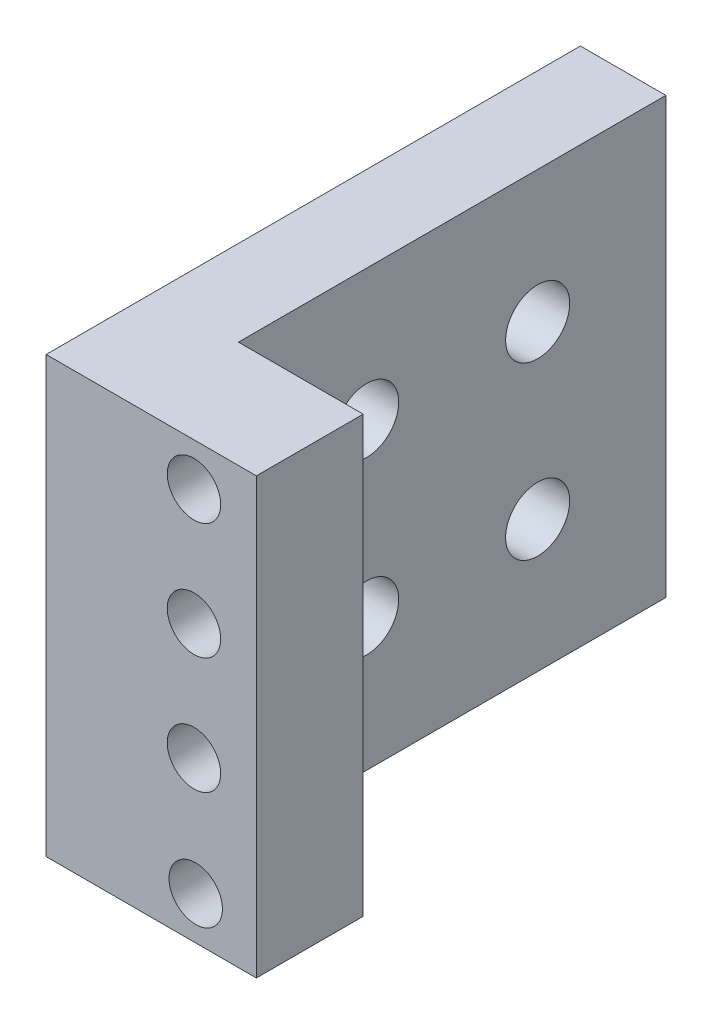
ISO-10303-21;
HEADER;
FILE_DESCRIPTION(('STEP AP214'),'2;1');
FILE_NAME('part.step','',(''),(''),'','','');
FILE_SCHEMA(('AUTOMOTIVE_DESIGN { 1 0 10303 214 1 1 1 1 }'));
ENDSEC;
DATA;
#1=APPLICATION_CONTEXT('core data for automotive mechanical design processes');
#2=APPLICATION_PROTOCOL_DEFINITION('international standard','automotive_design',2000,#1);
#3=PRODUCT_CONTEXT('',#1,'mechanical');
#4=PRODUCT('Part','Part','',(#3));
#5=PRODUCT_RELATED_PRODUCT_CATEGORY('part','',(#4));
#6=PRODUCT_DEFINITION_FORMATION('','',#4);
#7=PRODUCT_DEFINITION_CONTEXT('part definition',#1,'design');
#8=PRODUCT_DEFINITION('design','',#6,#7);
#9=PRODUCT_DEFINITION_SHAPE('','',#8);
#10=(LENGTH_UNIT() NAMED_UNIT(*) SI_UNIT(.MILLI.,.METRE.));
#11=(NAMED_UNIT(*) PLANE_ANGLE_UNIT() SI_UNIT($,.RADIAN.));
#12=(NAMED_UNIT(*) SI_UNIT($,.STERADIAN.) SOLID_ANGLE_UNIT());
#13=UNCERTAINTY_MEASURE_WITH_UNIT(LENGTH_MEASURE(1.E-05),#10,'distance_accuracy_value','');
#14=(GEOMETRIC_REPRESENTATION_CONTEXT(3) GLOBAL_UNCERTAINTY_ASSIGNED_CONTEXT((#13)) GLOBAL_UNIT_ASSIGNED_CONTEXT((#10,
#11,#12)) REPRESENTATION_CONTEXT('',''));
#15=CARTESIAN_POINT('',(0.,0.,0.));
#16=DIRECTION('',(0.,0.,1.));
#17=DIRECTION('',(1.,0.,0.));
#18=AXIS2_PLACEMENT_3D('',#15,#16,#17);
#19=CARTESIAN_POINT('',(0.,0.,5.));
#20=DIRECTION('',(0.,0.,-1.));
#21=DIRECTION('',(-1.,0.,0.));
#22=AXIS2_PLACEMENT_3D('',#19,#20,#21);
#23=PLANE('',#22);
#24=DIRECTION('',(0.,1.,0.));
#25=VECTOR('',#24,1.);
#26=CARTESIAN_POINT('',(2.83769731465408,-12.6118854219113,5.));
#27=LINE('',#26,#25);
#28=CARTESIAN_POINT('',(2.83769731465408,-12.6118854219113,5.));
#29=VERTEX_POINT('',#28);
#30=CARTESIAN_POINT('',(2.83769731465409,7.73752291264459,5.));
#31=VERTEX_POINT('',#30);
#32=EDGE_CURVE('E82',#29,#31,#27,.T.);
#33=ORIENTED_EDGE('',*,*,#32,.T.);
#34=DIRECTION('',(-1.,0.,0.));
#35=VECTOR('',#34,1.);
#36=CARTESIAN_POINT('',(-3.,7.73752291264459,5.));
#37=LINE('',#36,#35);
#38=CARTESIAN_POINT('',(-7.,7.73752291264459,5.));
#39=VERTEX_POINT('',#38);
#40=EDGE_CURVE('E92',#31,#39,#37,.T.);
#41=ORIENTED_EDGE('',*,*,#40,.T.);
#42=DIRECTION('',(0.,1.,0.));
#43=VECTOR('',#42,1.);
#44=CARTESIAN_POINT('',(-7.,7.73752291264459,5.));
#45=LINE('',#44,#43);
#46=CARTESIAN_POINT('',(-7.,-12.6118854219113,5.));
#47=VERTEX_POINT('',#46);
#48=EDGE_CURVE('E125',#47,#39,#45,.T.);
#49=ORIENTED_EDGE('',*,*,#48,.F.);
#50=DIRECTION('',(1.,0.,0.));
#51=VECTOR('',#50,1.);
#52=CARTESIAN_POINT('',(-3.,-12.6118854219113,5.));
#53=LINE('',#52,#51);
#54=EDGE_CURVE('E60',#47,#29,#53,.T.);
#55=ORIENTED_EDGE('',*,*,#54,.T.);
#56=EDGE_LOOP('',(#33,#41,#49,#55));
#57=FACE_BOUND('',#56,.T.);
#58=CARTESIAN_POINT('',(-0.0811513426729575,5.73752291264459,5.));
#59=DIRECTION('',(0.,0.,1.));
#60=DIRECTION('',(1.,0.,0.));
#61=AXIS2_PLACEMENT_3D('',#58,#59,#60);
#62=CIRCLE('',#61,1.25);
#63=CARTESIAN_POINT('',(1.16884865732704,5.73752291264459,5.));
#64=VERTEX_POINT('',#63);
#65=EDGE_CURVE('E90',#64,#64,#62,.T.);
#66=ORIENTED_EDGE('',*,*,#65,.F.);
#67=EDGE_LOOP('',(#66));
#68=FACE_BOUND('',#67,.T.);
#69=CARTESIAN_POINT('',(-0.0811513426729575,0.287522912644593,5.));
#70=DIRECTION('',(0.,0.,1.));
#71=DIRECTION('',(1.,0.,0.));
#72=AXIS2_PLACEMENT_3D('',#69,#70,#71);
#73=CIRCLE('',#72,1.25);
#74=CARTESIAN_POINT('',(1.16884865732704,0.287522912644593,5.));
#75=VERTEX_POINT('',#74);
#76=EDGE_CURVE('E102',#75,#75,#73,.T.);
#77=ORIENTED_EDGE('',*,*,#76,.F.);
#78=EDGE_LOOP('',(#77));
#79=FACE_BOUND('',#78,.T.);
#80=CARTESIAN_POINT('',(-0.0811513426729575,-5.16247708735541,5.));
#81=DIRECTION('',(0.,0.,1.));
#82=DIRECTION('',(1.,0.,0.));
#83=AXIS2_PLACEMENT_3D('',#80,#81,#82);
#84=CIRCLE('',#83,1.25);
#85=CARTESIAN_POINT('',(1.16884865732704,-5.16247708735541,5.));
#86=VERTEX_POINT('',#85);
#87=EDGE_CURVE('E108',#86,#86,#84,.T.);
#88=ORIENTED_EDGE('',*,*,#87,.F.);
#89=EDGE_LOOP('',(#88));
#90=FACE_BOUND('',#89,.T.);
#91=CARTESIAN_POINT('',(-0.000846901493414893,-10.6118854219113,5.));
#92=DIRECTION('',(0.,0.,1.));
#93=DIRECTION('',(1.,0.,0.));
#94=AXIS2_PLACEMENT_3D('',#91,#92,#93);
#95=CIRCLE('',#94,1.25);
#96=CARTESIAN_POINT('',(1.24915309850659,-10.6118854219113,5.));
#97=VERTEX_POINT('',#96);
#98=EDGE_CURVE('E114',#97,#97,#95,.T.);
#99=ORIENTED_EDGE('',*,*,#98,.F.);
#100=EDGE_LOOP('',(#99));
#101=FACE_BOUND('',#100,.T.);
#102=ADVANCED_FACE('F36',(#57,#68,#79,#90,#101),#23,.F.);
#103=CARTESIAN_POINT('',(0.,0.,0.));
#104=DIRECTION('',(0.,0.,-1.));
#105=DIRECTION('',(-1.,0.,0.));
#106=AXIS2_PLACEMENT_3D('',#103,#104,#105);
#107=PLANE('',#106);
#108=DIRECTION('',(0.,-1.,0.));
#109=VECTOR('',#108,1.);
#110=CARTESIAN_POINT('',(-3.,7.73752291264459,0.));
#111=LINE('',#110,#109);
#112=CARTESIAN_POINT('',(-3.,7.73752291264459,0.));
#113=VERTEX_POINT('',#112);
#114=CARTESIAN_POINT('',(-3.,-12.6118854219113,0.));
#115=VERTEX_POINT('',#114);
#116=EDGE_CURVE('E51',#113,#115,#111,.T.);
#117=ORIENTED_EDGE('',*,*,#116,.F.);
#118=DIRECTION('',(-1.,0.,0.));
#119=VECTOR('',#118,1.);
#120=CARTESIAN_POINT('',(-3.,7.73752291264459,0.));
#121=LINE('',#120,#119);
#122=CARTESIAN_POINT('',(2.83769731465409,7.73752291264459,0.));
#123=VERTEX_POINT('',#122);
#124=EDGE_CURVE('E83',#123,#113,#121,.T.);
#125=ORIENTED_EDGE('',*,*,#124,.F.);
#126=DIRECTION('',(0.,1.,0.));
#127=VECTOR('',#126,1.);
#128=CARTESIAN_POINT('',(2.83769731465409,7.73752291264459,0.));
#129=LINE('',#128,#127);
#130=CARTESIAN_POINT('',(2.83769731465408,-12.6118854219113,0.));
#131=VERTEX_POINT('',#130);
#132=EDGE_CURVE('E85',#131,#123,#129,.T.);
#133=ORIENTED_EDGE('',*,*,#132,.F.);
#134=DIRECTION('',(1.,0.,0.));
#135=VECTOR('',#134,1.);
#136=CARTESIAN_POINT('',(-3.,-12.6118854219113,0.));
#137=LINE('',#136,#135);
#138=EDGE_CURVE('E72',#115,#131,#137,.T.);
#139=ORIENTED_EDGE('',*,*,#138,.F.);
#140=EDGE_LOOP('',(#117,#125,#133,#139));
#141=FACE_BOUND('',#140,.T.);
#142=CARTESIAN_POINT('',(-0.0811513426729575,-5.16247708735541,0.));
#143=DIRECTION('',(0.,0.,1.));
#144=DIRECTION('',(1.,0.,0.));
#145=AXIS2_PLACEMENT_3D('',#142,#143,#144);
#146=CIRCLE('',#145,1.25);
#147=CARTESIAN_POINT('',(1.16884865732704,-5.16247708735541,0.));
#148=VERTEX_POINT('',#147);
#149=EDGE_CURVE('E111',#148,#148,#146,.T.);
#150=ORIENTED_EDGE('',*,*,#149,.T.);
#151=EDGE_LOOP('',(#150));
#152=FACE_BOUND('',#151,.T.);
#153=CARTESIAN_POINT('',(-0.0811513426729575,5.73752291264459,0.));
#154=DIRECTION('',(0.,0.,1.));
#155=DIRECTION('',(1.,0.,0.));
#156=AXIS2_PLACEMENT_3D('',#153,#154,#155);
#157=CIRCLE('',#156,1.25);
#158=CARTESIAN_POINT('',(1.16884865732704,5.73752291264459,0.));
#159=VERTEX_POINT('',#158);
#160=EDGE_CURVE('E99',#159,#159,#157,.T.);
#161=ORIENTED_EDGE('',*,*,#160,.T.);
#162=EDGE_LOOP('',(#161));
#163=FACE_BOUND('',#162,.T.);
#164=CARTESIAN_POINT('',(-0.0811513426729575,0.287522912644593,0.));
#165=DIRECTION('',(0.,0.,1.));
#166=DIRECTION('',(1.,0.,0.));
#167=AXIS2_PLACEMENT_3D('',#164,#165,#166);
#168=CIRCLE('',#167,1.25);
#169=CARTESIAN_POINT('',(1.16884865732704,0.287522912644593,0.));
#170=VERTEX_POINT('',#169);
#171=EDGE_CURVE('E105',#170,#170,#168,.T.);
#172=ORIENTED_EDGE('',*,*,#171,.T.);
#173=EDGE_LOOP('',(#172));
#174=FACE_BOUND('',#173,.T.);
#175=CARTESIAN_POINT('',(-0.000846901493414893,-10.6118854219113,0.));
#176=DIRECTION('',(0.,0.,1.));
#177=DIRECTION('',(1.,0.,0.));
#178=AXIS2_PLACEMENT_3D('',#175,#176,#177);
#179=CIRCLE('',#178,1.25);
#180=CARTESIAN_POINT('',(1.24915309850659,-10.6118854219113,0.));
#181=VERTEX_POINT('',#180);
#182=EDGE_CURVE('E117',#181,#181,#179,.T.);
#183=ORIENTED_EDGE('',*,*,#182,.T.);
#184=EDGE_LOOP('',(#183));
#185=FACE_BOUND('',#184,.T.);
#186=ADVANCED_FACE('F86',(#141,#152,#163,#174,#185),#107,.T.);
#187=CARTESIAN_POINT('',(2.83769731465409,7.73752291264459,5.));
#188=DIRECTION('',(-1.,0.,0.));
#189=DIRECTION('',(0.,-1.,0.));
#190=AXIS2_PLACEMENT_3D('',#187,#188,#189);
#191=PLANE('',#190);
#192=ORIENTED_EDGE('',*,*,#132,.T.);
#193=DIRECTION('',(0.,0.,-1.));
#194=VECTOR('',#193,1.);
#195=CARTESIAN_POINT('',(2.83769731465409,7.73752291264459,5.));
#196=LINE('',#195,#194);
#197=EDGE_CURVE('E11',#31,#123,#196,.T.);
#198=ORIENTED_EDGE('',*,*,#197,.F.);
#199=ORIENTED_EDGE('',*,*,#32,.F.);
#200=DIRECTION('',(0.,0.,-1.));
#201=VECTOR('',#200,1.);
#202=CARTESIAN_POINT('',(2.83769731465408,-12.6118854219113,5.));
#203=LINE('',#202,#201);
#204=EDGE_CURVE('E44',#29,#131,#203,.T.);
#205=ORIENTED_EDGE('',*,*,#204,.T.);
#206=EDGE_LOOP('',(#192,#198,#199,#205));
#207=FACE_BOUND('',#206,.T.);
#208=ADVANCED_FACE('F38',(#207),#191,.F.);
#209=CARTESIAN_POINT('',(-3.,7.73752291264459,5.));
#210=DIRECTION('',(0.,-1.,0.));
#211=DIRECTION('',(0.,0.,-1.));
#212=AXIS2_PLACEMENT_3D('',#209,#210,#211);
#213=PLANE('',#212);
#214=ORIENTED_EDGE('',*,*,#124,.T.);
#215=DIRECTION('',(0.,0.,1.));
#216=VECTOR('',#215,1.);
#217=CARTESIAN_POINT('',(-3.,7.73752291264459,-20.));
#218=LINE('',#217,#216);
#219=CARTESIAN_POINT('',(-3.,7.73752291264459,-20.));
#220=VERTEX_POINT('',#219);
#221=EDGE_CURVE('E131',#220,#113,#218,.T.);
#222=ORIENTED_EDGE('',*,*,#221,.F.);
#223=DIRECTION('',(-1.,0.,0.));
#224=VECTOR('',#223,1.);
#225=CARTESIAN_POINT('',(-3.,7.73752291264459,-20.));
#226=LINE('',#225,#224);
#227=CARTESIAN_POINT('',(-7.,7.73752291264459,-20.));
#228=VERTEX_POINT('',#227);
#229=EDGE_CURVE('E141',#220,#228,#226,.T.);
#230=ORIENTED_EDGE('',*,*,#229,.T.);
#231=DIRECTION('',(0.,0.,-1.));
#232=VECTOR('',#231,1.);
#233=CARTESIAN_POINT('',(-7.,7.73752291264459,0.));
#234=LINE('',#233,#232);
#235=EDGE_CURVE('E120',#39,#228,#234,.T.);
#236=ORIENTED_EDGE('',*,*,#235,.F.);
#237=ORIENTED_EDGE('',*,*,#40,.F.);
#238=ORIENTED_EDGE('',*,*,#197,.T.);
#239=EDGE_LOOP('',(#214,#222,#230,#236,#237,#238));
#240=FACE_BOUND('',#239,.T.);
#241=ADVANCED_FACE('F201',(#240),#213,.F.);
#242=CARTESIAN_POINT('',(-3.,-12.6118854219113,5.));
#243=DIRECTION('',(0.,1.,0.));
#244=DIRECTION('',(0.,0.,1.));
#245=AXIS2_PLACEMENT_3D('',#242,#243,#244);
#246=PLANE('',#245);
#247=DIRECTION('',(0.,0.,1.));
#248=VECTOR('',#247,1.);
#249=CARTESIAN_POINT('',(-7.,-12.6118854219113,0.));
#250=LINE('',#249,#248);
#251=CARTESIAN_POINT('',(-7.,-12.6118854219113,-20.));
#252=VERTEX_POINT('',#251);
#253=EDGE_CURVE('E128',#252,#47,#250,.T.);
#254=ORIENTED_EDGE('',*,*,#253,.F.);
#255=DIRECTION('',(-1.,0.,0.));
#256=VECTOR('',#255,1.);
#257=CARTESIAN_POINT('',(-3.,-12.6118854219113,-20.));
#258=LINE('',#257,#256);
#259=CARTESIAN_POINT('',(-3.,-12.6118854219113,-20.));
#260=VERTEX_POINT('',#259);
#261=EDGE_CURVE('E137',#260,#252,#258,.T.);
#262=ORIENTED_EDGE('',*,*,#261,.F.);
#263=DIRECTION('',(0.,0.,1.));
#264=VECTOR('',#263,1.);
#265=CARTESIAN_POINT('',(-3.,-12.6118854219113,-20.));
#266=LINE('',#265,#264);
#267=EDGE_CURVE('E81',#260,#115,#266,.T.);
#268=ORIENTED_EDGE('',*,*,#267,.T.);
#269=ORIENTED_EDGE('',*,*,#138,.T.);
#270=ORIENTED_EDGE('',*,*,#204,.F.);
#271=ORIENTED_EDGE('',*,*,#54,.F.);
#272=EDGE_LOOP('',(#254,#262,#268,#269,#270,#271));
#273=FACE_BOUND('',#272,.T.);
#274=ADVANCED_FACE('F75',(#273),#246,.F.);
#275=CARTESIAN_POINT('',(-0.0811513426729575,5.73752291264459,5.));
#276=DIRECTION('',(0.,0.,-1.));
#277=DIRECTION('',(-1.,0.,0.));
#278=AXIS2_PLACEMENT_3D('',#275,#276,#277);
#279=CYLINDRICAL_SURFACE('',#278,1.25);
#280=ORIENTED_EDGE('',*,*,#65,.T.);
#281=EDGE_LOOP('',(#280));
#282=FACE_BOUND('',#281,.T.);
#283=ORIENTED_EDGE('',*,*,#160,.F.);
#284=EDGE_LOOP('',(#283));
#285=FACE_BOUND('',#284,.T.);
#286=ADVANCED_FACE('F221',(#282,#285),#279,.F.);
#287=CARTESIAN_POINT('',(-0.0811513426729575,0.287522912644593,5.));
#288=DIRECTION('',(0.,0.,-1.));
#289=DIRECTION('',(-1.,0.,0.));
#290=AXIS2_PLACEMENT_3D('',#287,#288,#289);
#291=CYLINDRICAL_SURFACE('',#290,1.25);
#292=ORIENTED_EDGE('',*,*,#76,.T.);
#293=EDGE_LOOP('',(#292));
#294=FACE_BOUND('',#293,.T.);
#295=ORIENTED_EDGE('',*,*,#171,.F.);
#296=EDGE_LOOP('',(#295));
#297=FACE_BOUND('',#296,.T.);
#298=ADVANCED_FACE('F337',(#294,#297),#291,.F.);
#299=CARTESIAN_POINT('',(-0.0811513426729575,-5.16247708735541,5.));
#300=DIRECTION('',(0.,0.,-1.));
#301=DIRECTION('',(-1.,0.,0.));
#302=AXIS2_PLACEMENT_3D('',#299,#300,#301);
#303=CYLINDRICAL_SURFACE('',#302,1.25);
#304=ORIENTED_EDGE('',*,*,#87,.T.);
#305=EDGE_LOOP('',(#304));
#306=FACE_BOUND('',#305,.T.);
#307=ORIENTED_EDGE('',*,*,#149,.F.);
#308=EDGE_LOOP('',(#307));
#309=FACE_BOUND('',#308,.T.);
#310=ADVANCED_FACE('F329',(#306,#309),#303,.F.);
#311=CARTESIAN_POINT('',(-0.000846901493414893,-10.6118854219113,5.));
#312=DIRECTION('',(0.,0.,-1.));
#313=DIRECTION('',(-1.,0.,0.));
#314=AXIS2_PLACEMENT_3D('',#311,#312,#313);
#315=CYLINDRICAL_SURFACE('',#314,1.25);
#316=ORIENTED_EDGE('',*,*,#98,.T.);
#317=EDGE_LOOP('',(#316));
#318=FACE_BOUND('',#317,.T.);
#319=ORIENTED_EDGE('',*,*,#182,.F.);
#320=EDGE_LOOP('',(#319));
#321=FACE_BOUND('',#320,.T.);
#322=ADVANCED_FACE('F269',(#318,#321),#315,.F.);
#323=CARTESIAN_POINT('',(-7.,0.,0.));
#324=DIRECTION('',(-1.,0.,0.));
#325=DIRECTION('',(0.,0.,1.));
#326=AXIS2_PLACEMENT_3D('',#323,#324,#325);
#327=PLANE('',#326);
#328=CARTESIAN_POINT('',(-7.,-6.43718125463334,-6.));
#329=DIRECTION('',(-1.,0.,0.));
#330=DIRECTION('',(0.,0.,1.));
#331=AXIS2_PLACEMENT_3D('',#328,#329,#330);
#332=CIRCLE('',#331,1.5);
#333=CARTESIAN_POINT('',(-7.,-6.43718125463334,-4.5));
#334=VERTEX_POINT('',#333);
#335=EDGE_CURVE('E138',#334,#334,#332,.T.);
#336=ORIENTED_EDGE('',*,*,#335,.F.);
#337=EDGE_LOOP('',(#336));
#338=FACE_BOUND('',#337,.T.);
#339=CARTESIAN_POINT('',(-7.,-6.43718125463334,-14.));
#340=DIRECTION('',(-1.,0.,0.));
#341=DIRECTION('',(0.,0.,1.));
#342=AXIS2_PLACEMENT_3D('',#339,#340,#341);
#343=CIRCLE('',#342,1.5);
#344=CARTESIAN_POINT('',(-7.,-6.43718125463334,-12.5));
#345=VERTEX_POINT('',#344);
#346=EDGE_CURVE('E151',#345,#345,#343,.T.);
#347=ORIENTED_EDGE('',*,*,#346,.F.);
#348=EDGE_LOOP('',(#347));
#349=FACE_BOUND('',#348,.T.);
#350=CARTESIAN_POINT('',(-7.,1.56281874536667,-14.));
#351=DIRECTION('',(-1.,0.,0.));
#352=DIRECTION('',(0.,0.,1.));
#353=AXIS2_PLACEMENT_3D('',#350,#351,#352);
#354=CIRCLE('',#353,1.5);
#355=CARTESIAN_POINT('',(-7.,1.56281874536667,-12.5));
#356=VERTEX_POINT('',#355);
#357=EDGE_CURVE('E154',#356,#356,#354,.T.);
#358=ORIENTED_EDGE('',*,*,#357,.F.);
#359=EDGE_LOOP('',(#358));
#360=FACE_BOUND('',#359,.T.);
#361=CARTESIAN_POINT('',(-7.,1.56281874536667,-6.));
#362=DIRECTION('',(-1.,0.,0.));
#363=DIRECTION('',(0.,0.,1.));
#364=AXIS2_PLACEMENT_3D('',#361,#362,#363);
#365=CIRCLE('',#364,1.5);
#366=CARTESIAN_POINT('',(-7.,1.56281874536667,-4.5));
#367=VERTEX_POINT('',#366);
#368=EDGE_CURVE('E157',#367,#367,#365,.T.);
#369=ORIENTED_EDGE('',*,*,#368,.F.);
#370=EDGE_LOOP('',(#369));
#371=FACE_BOUND('',#370,.T.);
#372=ORIENTED_EDGE('',*,*,#235,.T.);
#373=DIRECTION('',(0.,-1.,0.));
#374=VECTOR('',#373,1.);
#375=CARTESIAN_POINT('',(-7.,7.73752291264459,-20.));
#376=LINE('',#375,#374);
#377=EDGE_CURVE('E144',#228,#252,#376,.T.);
#378=ORIENTED_EDGE('',*,*,#377,.T.);
#379=ORIENTED_EDGE('',*,*,#253,.T.);
#380=ORIENTED_EDGE('',*,*,#48,.T.);
#381=EDGE_LOOP('',(#372,#378,#379,#380));
#382=FACE_BOUND('',#381,.T.);
#383=ADVANCED_FACE('F179',(#338,#349,#360,#371,#382),#327,.T.);
#384=CARTESIAN_POINT('',(-3.,7.73752291264459,-20.));
#385=DIRECTION('',(-1.,0.,0.));
#386=DIRECTION('',(0.,-1.,0.));
#387=AXIS2_PLACEMENT_3D('',#384,#385,#386);
#388=PLANE('',#387);
#389=CARTESIAN_POINT('',(-3.,-6.43718125463334,-6.));
#390=DIRECTION('',(1.,0.,0.));
#391=DIRECTION('',(0.,-1.,0.));
#392=AXIS2_PLACEMENT_3D('',#389,#390,#391);
#393=CIRCLE('',#392,1.5);
#394=CARTESIAN_POINT('',(-3.,-7.93718125463333,-6.));
#395=VERTEX_POINT('',#394);
#396=EDGE_CURVE('E164',#395,#395,#393,.T.);
#397=ORIENTED_EDGE('',*,*,#396,.F.);
#398=EDGE_LOOP('',(#397));
#399=FACE_BOUND('',#398,.T.);
#400=CARTESIAN_POINT('',(-3.,-6.43718125463334,-14.));
#401=DIRECTION('',(1.,0.,0.));
#402=DIRECTION('',(0.,1.,0.));
#403=AXIS2_PLACEMENT_3D('',#400,#401,#402);
#404=CIRCLE('',#403,1.5);
#405=CARTESIAN_POINT('',(-3.,-4.93718125463334,-14.));
#406=VERTEX_POINT('',#405);
#407=EDGE_CURVE('E167',#406,#406,#404,.T.);
#408=ORIENTED_EDGE('',*,*,#407,.F.);
#409=EDGE_LOOP('',(#408));
#410=FACE_BOUND('',#409,.T.);
#411=CARTESIAN_POINT('',(-3.,1.56281874536666,-14.));
#412=DIRECTION('',(1.,0.,0.));
#413=DIRECTION('',(0.,-1.,0.));
#414=AXIS2_PLACEMENT_3D('',#411,#412,#413);
#415=CIRCLE('',#414,1.5);
#416=CARTESIAN_POINT('',(-3.,0.062818745366666,-14.));
#417=VERTEX_POINT('',#416);
#418=EDGE_CURVE('E163',#417,#417,#415,.T.);
#419=ORIENTED_EDGE('',*,*,#418,.F.);
#420=EDGE_LOOP('',(#419));
#421=FACE_BOUND('',#420,.T.);
#422=CARTESIAN_POINT('',(-3.,1.56281874536666,-6.));
#423=DIRECTION('',(1.,0.,0.));
#424=DIRECTION('',(0.,1.,0.));
#425=AXIS2_PLACEMENT_3D('',#422,#423,#424);
#426=CIRCLE('',#425,1.5);
#427=CARTESIAN_POINT('',(-3.,3.06281874536666,-6.));
#428=VERTEX_POINT('',#427);
#429=EDGE_CURVE('E160',#428,#428,#426,.T.);
#430=ORIENTED_EDGE('',*,*,#429,.F.);
#431=EDGE_LOOP('',(#430));
#432=FACE_BOUND('',#431,.T.);
#433=ORIENTED_EDGE('',*,*,#116,.T.);
#434=ORIENTED_EDGE('',*,*,#267,.F.);
#435=DIRECTION('',(0.,-1.,0.));
#436=VECTOR('',#435,1.);
#437=CARTESIAN_POINT('',(-3.,7.73752291264459,-20.));
#438=LINE('',#437,#436);
#439=EDGE_CURVE('E135',#220,#260,#438,.T.);
#440=ORIENTED_EDGE('',*,*,#439,.F.);
#441=ORIENTED_EDGE('',*,*,#221,.T.);
#442=EDGE_LOOP('',(#433,#434,#440,#441));
#443=FACE_BOUND('',#442,.T.);
#444=ADVANCED_FACE('F175',(#399,#410,#421,#432,#443),#388,.F.);
#445=CARTESIAN_POINT('',(0.,0.,-20.));
#446=DIRECTION('',(0.,0.,1.));
#447=DIRECTION('',(1.,0.,0.));
#448=AXIS2_PLACEMENT_3D('',#445,#446,#447);
#449=PLANE('',#448);
#450=ORIENTED_EDGE('',*,*,#261,.T.);
#451=ORIENTED_EDGE('',*,*,#377,.F.);
#452=ORIENTED_EDGE('',*,*,#229,.F.);
#453=ORIENTED_EDGE('',*,*,#439,.T.);
#454=EDGE_LOOP('',(#450,#451,#452,#453));
#455=FACE_BOUND('',#454,.T.);
#456=ADVANCED_FACE('F178',(#455),#449,.F.);
#457=CARTESIAN_POINT('',(-23.,1.56281874536667,-6.));
#458=DIRECTION('',(1.,0.,0.));
#459=DIRECTION('',(0.,1.,0.));
#460=AXIS2_PLACEMENT_3D('',#457,#458,#459);
#461=CYLINDRICAL_SURFACE('',#460,1.5);
#462=ORIENTED_EDGE('',*,*,#368,.T.);
#463=EDGE_LOOP('',(#462));
#464=FACE_BOUND('',#463,.T.);
#465=ORIENTED_EDGE('',*,*,#429,.T.);
#466=EDGE_LOOP('',(#465));
#467=FACE_BOUND('',#466,.T.);
#468=ADVANCED_FACE('F207',(#464,#467),#461,.F.);
#469=CARTESIAN_POINT('',(-23.,1.56281874536667,-14.));
#470=DIRECTION('',(1.,0.,0.));
#471=DIRECTION('',(0.,1.,0.));
#472=AXIS2_PLACEMENT_3D('',#469,#470,#471);
#473=CYLINDRICAL_SURFACE('',#472,1.5);
#474=ORIENTED_EDGE('',*,*,#357,.T.);
#475=EDGE_LOOP('',(#474));
#476=FACE_BOUND('',#475,.T.);
#477=ORIENTED_EDGE('',*,*,#418,.T.);
#478=EDGE_LOOP('',(#477));
#479=FACE_BOUND('',#478,.T.);
#480=ADVANCED_FACE('F173',(#476,#479),#473,.F.);
#481=CARTESIAN_POINT('',(-23.,-6.43718125463333,-14.));
#482=DIRECTION('',(1.,0.,0.));
#483=DIRECTION('',(0.,1.,0.));
#484=AXIS2_PLACEMENT_3D('',#481,#482,#483);
#485=CYLINDRICAL_SURFACE('',#484,1.5);
#486=ORIENTED_EDGE('',*,*,#346,.T.);
#487=EDGE_LOOP('',(#486));
#488=FACE_BOUND('',#487,.T.);
#489=ORIENTED_EDGE('',*,*,#407,.T.);
#490=EDGE_LOOP('',(#489));
#491=FACE_BOUND('',#490,.T.);
#492=ADVANCED_FACE('F290',(#488,#491),#485,.F.);
#493=CARTESIAN_POINT('',(-23.,-6.43718125463333,-6.));
#494=DIRECTION('',(1.,0.,0.));
#495=DIRECTION('',(0.,1.,0.));
#496=AXIS2_PLACEMENT_3D('',#493,#494,#495);
#497=CYLINDRICAL_SURFACE('',#496,1.5);
#498=ORIENTED_EDGE('',*,*,#335,.T.);
#499=EDGE_LOOP('',(#498));
#500=FACE_BOUND('',#499,.T.);
#501=ORIENTED_EDGE('',*,*,#396,.T.);
#502=EDGE_LOOP('',(#501));
#503=FACE_BOUND('',#502,.T.);
#504=ADVANCED_FACE('F300',(#500,#503),#497,.F.);
#505=CLOSED_SHELL('',(#102,#186,#208,#241,#274,#286,#298,#310,#322,#383,#444,#456,#468,#480,
#492,#504));
#506=MANIFOLD_SOLID_BREP('B2',#505);
#507=ADVANCED_BREP_SHAPE_REPRESENTATION('',(#18,#506),#14);
#508=SHAPE_DEFINITION_REPRESENTATION(#9,#507);
ENDSEC;
END-ISO-10303-21;
